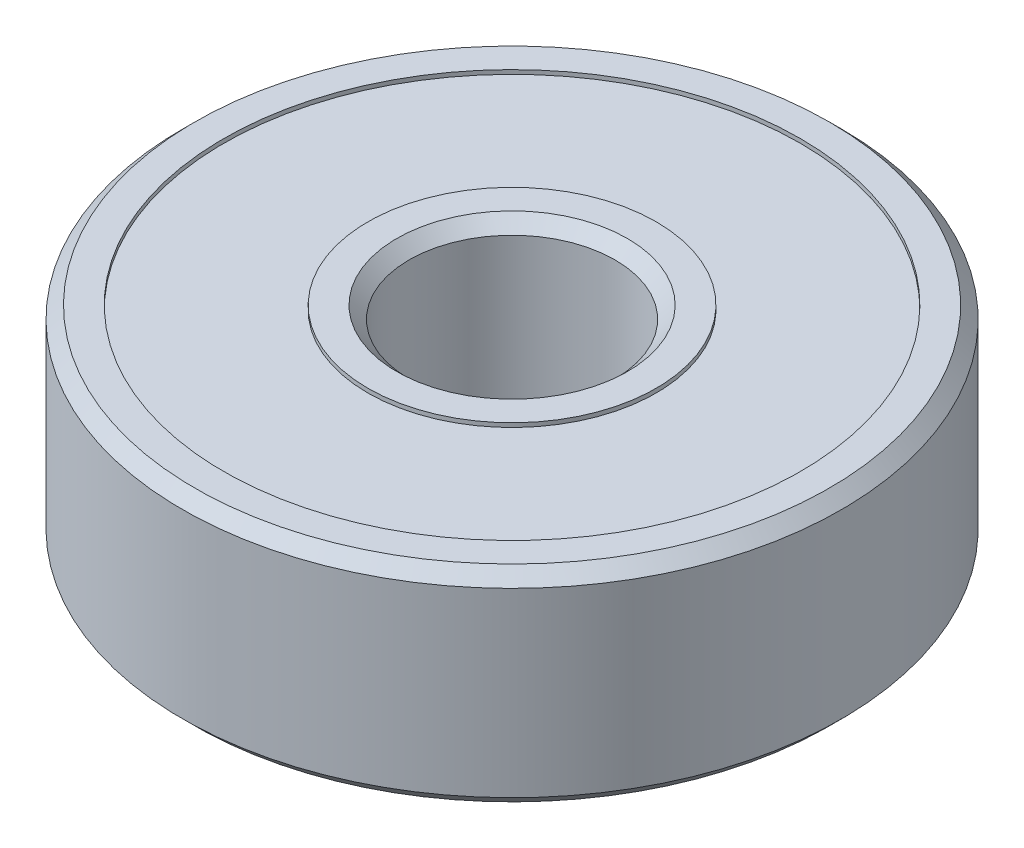
ISO-10303-21;
HEADER;
FILE_DESCRIPTION(('STEP AP214'),'2;1');
FILE_NAME('part.step','',(''),(''),'','','');
FILE_SCHEMA(('AUTOMOTIVE_DESIGN { 1 0 10303 214 1 1 1 1 }'));
ENDSEC;
DATA;
#1=APPLICATION_CONTEXT('core data for automotive mechanical design processes');
#2=APPLICATION_PROTOCOL_DEFINITION('international standard','automotive_design',2000,#1);
#3=PRODUCT_CONTEXT('',#1,'mechanical');
#4=PRODUCT('Part','Part','',(#3));
#5=PRODUCT_RELATED_PRODUCT_CATEGORY('part','',(#4));
#6=PRODUCT_DEFINITION_FORMATION('','',#4);
#7=PRODUCT_DEFINITION_CONTEXT('part definition',#1,'design');
#8=PRODUCT_DEFINITION('design','',#6,#7);
#9=PRODUCT_DEFINITION_SHAPE('','',#8);
#10=(LENGTH_UNIT() NAMED_UNIT(*) SI_UNIT(.MILLI.,.METRE.));
#11=(NAMED_UNIT(*) PLANE_ANGLE_UNIT() SI_UNIT($,.RADIAN.));
#12=(NAMED_UNIT(*) SI_UNIT($,.STERADIAN.) SOLID_ANGLE_UNIT());
#13=UNCERTAINTY_MEASURE_WITH_UNIT(LENGTH_MEASURE(1.E-05),#10,'distance_accuracy_value','');
#14=(GEOMETRIC_REPRESENTATION_CONTEXT(3) GLOBAL_UNCERTAINTY_ASSIGNED_CONTEXT((#13)) GLOBAL_UNIT_ASSIGNED_CONTEXT((#10,
#11,#12)) REPRESENTATION_CONTEXT('',''));
#15=CARTESIAN_POINT('',(0.,0.,0.));
#16=DIRECTION('',(0.,0.,1.));
#17=DIRECTION('',(1.,0.,0.));
#18=AXIS2_PLACEMENT_3D('',#15,#16,#17);
#19=CARTESIAN_POINT('',(0.,2.5,0.));
#20=DIRECTION('',(0.,1.,0.));
#21=DIRECTION('',(0.,0.,1.));
#22=AXIS2_PLACEMENT_3D('',#19,#20,#21);
#23=CONICAL_SURFACE('',#22,2.8,0.785398163397448);
#24=CARTESIAN_POINT('',(0.,2.2,0.));
#25=DIRECTION('',(0.,-1.,0.));
#26=DIRECTION('',(0.,0.,-1.));
#27=AXIS2_PLACEMENT_3D('',#24,#25,#26);
#28=CIRCLE('',#27,2.5);
#29=CARTESIAN_POINT('',(0.,2.2,-2.5));
#30=VERTEX_POINT('',#29);
#31=EDGE_CURVE('E84',#30,#30,#28,.T.);
#32=ORIENTED_EDGE('',*,*,#31,.T.);
#33=EDGE_LOOP('',(#32));
#34=FACE_BOUND('',#33,.T.);
#35=CARTESIAN_POINT('',(0.,2.5,0.));
#36=DIRECTION('',(0.,-1.,0.));
#37=DIRECTION('',(0.,0.,-1.));
#38=AXIS2_PLACEMENT_3D('',#35,#36,#37);
#39=CIRCLE('',#38,2.8);
#40=CARTESIAN_POINT('',(0.,2.5,-2.8));
#41=VERTEX_POINT('',#40);
#42=EDGE_CURVE('E10',#41,#41,#39,.T.);
#43=ORIENTED_EDGE('',*,*,#42,.F.);
#44=EDGE_LOOP('',(#43));
#45=FACE_BOUND('',#44,.T.);
#46=ADVANCED_FACE('F32',(#34,#45),#23,.F.);
#47=CARTESIAN_POINT('',(2.8,2.5,0.));
#48=DIRECTION('',(0.,1.,0.));
#49=DIRECTION('',(0.,0.,1.));
#50=AXIS2_PLACEMENT_3D('',#47,#48,#49);
#51=PLANE('',#50);
#52=ORIENTED_EDGE('',*,*,#42,.T.);
#53=EDGE_LOOP('',(#52));
#54=FACE_BOUND('',#53,.T.);
#55=CARTESIAN_POINT('',(0.,2.5,0.));
#56=DIRECTION('',(0.,-1.,0.));
#57=DIRECTION('',(0.,0.,-1.));
#58=AXIS2_PLACEMENT_3D('',#55,#56,#57);
#59=CIRCLE('',#58,3.5);
#60=CARTESIAN_POINT('',(0.,2.5,-3.5));
#61=VERTEX_POINT('',#60);
#62=EDGE_CURVE('E38',#61,#61,#59,.T.);
#63=ORIENTED_EDGE('',*,*,#62,.F.);
#64=EDGE_LOOP('',(#63));
#65=FACE_BOUND('',#64,.T.);
#66=ADVANCED_FACE('F102',(#54,#65),#51,.T.);
#67=CARTESIAN_POINT('',(0.,0.,0.));
#68=DIRECTION('',(0.,-1.,0.));
#69=DIRECTION('',(0.,0.,-1.));
#70=AXIS2_PLACEMENT_3D('',#67,#68,#69);
#71=CYLINDRICAL_SURFACE('',#70,3.5);
#72=ORIENTED_EDGE('',*,*,#62,.T.);
#73=EDGE_LOOP('',(#72));
#74=FACE_BOUND('',#73,.T.);
#75=CARTESIAN_POINT('',(0.,2.4,0.));
#76=DIRECTION('',(0.,-1.,0.));
#77=DIRECTION('',(0.,0.,-1.));
#78=AXIS2_PLACEMENT_3D('',#75,#76,#77);
#79=CIRCLE('',#78,3.5);
#80=CARTESIAN_POINT('',(0.,2.4,-3.5));
#81=VERTEX_POINT('',#80);
#82=EDGE_CURVE('E42',#81,#81,#79,.T.);
#83=ORIENTED_EDGE('',*,*,#82,.F.);
#84=EDGE_LOOP('',(#83));
#85=FACE_BOUND('',#84,.T.);
#86=ADVANCED_FACE('F106',(#74,#85),#71,.T.);
#87=CARTESIAN_POINT('',(3.5,2.4,0.));
#88=DIRECTION('',(0.,1.,0.));
#89=DIRECTION('',(0.,0.,1.));
#90=AXIS2_PLACEMENT_3D('',#87,#88,#89);
#91=PLANE('',#90);
#92=ORIENTED_EDGE('',*,*,#82,.T.);
#93=EDGE_LOOP('',(#92));
#94=FACE_BOUND('',#93,.T.);
#95=CARTESIAN_POINT('',(0.,2.4,0.));
#96=DIRECTION('',(0.,-1.,0.));
#97=DIRECTION('',(0.,0.,-1.));
#98=AXIS2_PLACEMENT_3D('',#95,#96,#97);
#99=CIRCLE('',#98,7.);
#100=CARTESIAN_POINT('',(0.,2.4,-7.));
#101=VERTEX_POINT('',#100);
#102=EDGE_CURVE('E46',#101,#101,#99,.T.);
#103=ORIENTED_EDGE('',*,*,#102,.F.);
#104=EDGE_LOOP('',(#103));
#105=FACE_BOUND('',#104,.T.);
#106=ADVANCED_FACE('F110',(#94,#105),#91,.T.);
#107=CARTESIAN_POINT('',(0.,0.,0.));
#108=DIRECTION('',(0.,-1.,0.));
#109=DIRECTION('',(0.,0.,-1.));
#110=AXIS2_PLACEMENT_3D('',#107,#108,#109);
#111=CYLINDRICAL_SURFACE('',#110,7.);
#112=ORIENTED_EDGE('',*,*,#102,.T.);
#113=EDGE_LOOP('',(#112));
#114=FACE_BOUND('',#113,.T.);
#115=CARTESIAN_POINT('',(0.,2.5,0.));
#116=DIRECTION('',(0.,-1.,0.));
#117=DIRECTION('',(0.,0.,-1.));
#118=AXIS2_PLACEMENT_3D('',#115,#116,#117);
#119=CIRCLE('',#118,7.);
#120=CARTESIAN_POINT('',(0.,2.5,-7.));
#121=VERTEX_POINT('',#120);
#122=EDGE_CURVE('E51',#121,#121,#119,.T.);
#123=ORIENTED_EDGE('',*,*,#122,.F.);
#124=EDGE_LOOP('',(#123));
#125=FACE_BOUND('',#124,.T.);
#126=ADVANCED_FACE('F116',(#114,#125),#111,.F.);
#127=CARTESIAN_POINT('',(7.,2.5,0.));
#128=DIRECTION('',(0.,1.,0.));
#129=DIRECTION('',(0.,0.,1.));
#130=AXIS2_PLACEMENT_3D('',#127,#128,#129);
#131=PLANE('',#130);
#132=ORIENTED_EDGE('',*,*,#122,.T.);
#133=EDGE_LOOP('',(#132));
#134=FACE_BOUND('',#133,.T.);
#135=CARTESIAN_POINT('',(0.,2.5,0.));
#136=DIRECTION('',(0.,-1.,0.));
#137=DIRECTION('',(0.,0.,-1.));
#138=AXIS2_PLACEMENT_3D('',#135,#136,#137);
#139=CIRCLE('',#138,7.7);
#140=CARTESIAN_POINT('',(0.,2.5,-7.7));
#141=VERTEX_POINT('',#140);
#142=EDGE_CURVE('E54',#141,#141,#139,.T.);
#143=ORIENTED_EDGE('',*,*,#142,.F.);
#144=EDGE_LOOP('',(#143));
#145=FACE_BOUND('',#144,.T.);
#146=ADVANCED_FACE('F120',(#134,#145),#131,.T.);
#147=CARTESIAN_POINT('',(0.,2.2,0.));
#148=DIRECTION('',(0.,-1.,0.));
#149=DIRECTION('',(0.,0.,-1.));
#150=AXIS2_PLACEMENT_3D('',#147,#148,#149);
#151=CONICAL_SURFACE('',#150,8.,0.785398163397448);
#152=ORIENTED_EDGE('',*,*,#142,.T.);
#153=EDGE_LOOP('',(#152));
#154=FACE_BOUND('',#153,.T.);
#155=CARTESIAN_POINT('',(0.,2.2,0.));
#156=DIRECTION('',(0.,-1.,0.));
#157=DIRECTION('',(0.,0.,-1.));
#158=AXIS2_PLACEMENT_3D('',#155,#156,#157);
#159=CIRCLE('',#158,8.);
#160=CARTESIAN_POINT('',(0.,2.2,-8.));
#161=VERTEX_POINT('',#160);
#162=EDGE_CURVE('E57',#161,#161,#159,.T.);
#163=ORIENTED_EDGE('',*,*,#162,.F.);
#164=EDGE_LOOP('',(#163));
#165=FACE_BOUND('',#164,.T.);
#166=ADVANCED_FACE('F124',(#154,#165),#151,.T.);
#167=CARTESIAN_POINT('',(0.,0.,0.));
#168=DIRECTION('',(0.,-1.,0.));
#169=DIRECTION('',(0.,0.,-1.));
#170=AXIS2_PLACEMENT_3D('',#167,#168,#169);
#171=CYLINDRICAL_SURFACE('',#170,8.);
#172=ORIENTED_EDGE('',*,*,#162,.T.);
#173=EDGE_LOOP('',(#172));
#174=FACE_BOUND('',#173,.T.);
#175=CARTESIAN_POINT('',(0.,-2.2,0.));
#176=DIRECTION('',(0.,-1.,0.));
#177=DIRECTION('',(0.,0.,-1.));
#178=AXIS2_PLACEMENT_3D('',#175,#176,#177);
#179=CIRCLE('',#178,8.);
#180=CARTESIAN_POINT('',(0.,-2.2,-8.));
#181=VERTEX_POINT('',#180);
#182=EDGE_CURVE('E60',#181,#181,#179,.T.);
#183=ORIENTED_EDGE('',*,*,#182,.F.);
#184=EDGE_LOOP('',(#183));
#185=FACE_BOUND('',#184,.T.);
#186=ADVANCED_FACE('F128',(#174,#185),#171,.T.);
#187=CARTESIAN_POINT('',(0.,-2.5,0.));
#188=DIRECTION('',(0.,1.,0.));
#189=DIRECTION('',(0.,0.,1.));
#190=AXIS2_PLACEMENT_3D('',#187,#188,#189);
#191=CONICAL_SURFACE('',#190,7.7,0.785398163397448);
#192=ORIENTED_EDGE('',*,*,#182,.T.);
#193=EDGE_LOOP('',(#192));
#194=FACE_BOUND('',#193,.T.);
#195=CARTESIAN_POINT('',(0.,-2.5,0.));
#196=DIRECTION('',(0.,-1.,0.));
#197=DIRECTION('',(0.,0.,-1.));
#198=AXIS2_PLACEMENT_3D('',#195,#196,#197);
#199=CIRCLE('',#198,7.7);
#200=CARTESIAN_POINT('',(0.,-2.5,-7.7));
#201=VERTEX_POINT('',#200);
#202=EDGE_CURVE('E63',#201,#201,#199,.T.);
#203=ORIENTED_EDGE('',*,*,#202,.F.);
#204=EDGE_LOOP('',(#203));
#205=FACE_BOUND('',#204,.T.);
#206=ADVANCED_FACE('F132',(#194,#205),#191,.T.);
#207=CARTESIAN_POINT('',(7.,-2.5,0.));
#208=DIRECTION('',(0.,-1.,0.));
#209=DIRECTION('',(0.,0.,-1.));
#210=AXIS2_PLACEMENT_3D('',#207,#208,#209);
#211=PLANE('',#210);
#212=ORIENTED_EDGE('',*,*,#202,.T.);
#213=EDGE_LOOP('',(#212));
#214=FACE_BOUND('',#213,.T.);
#215=CARTESIAN_POINT('',(0.,-2.5,0.));
#216=DIRECTION('',(0.,-1.,0.));
#217=DIRECTION('',(0.,0.,-1.));
#218=AXIS2_PLACEMENT_3D('',#215,#216,#217);
#219=CIRCLE('',#218,7.);
#220=CARTESIAN_POINT('',(0.,-2.5,-7.));
#221=VERTEX_POINT('',#220);
#222=EDGE_CURVE('E66',#221,#221,#219,.T.);
#223=ORIENTED_EDGE('',*,*,#222,.F.);
#224=EDGE_LOOP('',(#223));
#225=FACE_BOUND('',#224,.T.);
#226=ADVANCED_FACE('F136',(#214,#225),#211,.T.);
#227=CARTESIAN_POINT('',(0.,0.,0.));
#228=DIRECTION('',(0.,-1.,0.));
#229=DIRECTION('',(0.,0.,-1.));
#230=AXIS2_PLACEMENT_3D('',#227,#228,#229);
#231=CYLINDRICAL_SURFACE('',#230,7.);
#232=ORIENTED_EDGE('',*,*,#222,.T.);
#233=EDGE_LOOP('',(#232));
#234=FACE_BOUND('',#233,.T.);
#235=CARTESIAN_POINT('',(0.,-2.4,0.));
#236=DIRECTION('',(0.,-1.,0.));
#237=DIRECTION('',(0.,0.,-1.));
#238=AXIS2_PLACEMENT_3D('',#235,#236,#237);
#239=CIRCLE('',#238,7.);
#240=CARTESIAN_POINT('',(0.,-2.4,-7.));
#241=VERTEX_POINT('',#240);
#242=EDGE_CURVE('E69',#241,#241,#239,.T.);
#243=ORIENTED_EDGE('',*,*,#242,.F.);
#244=EDGE_LOOP('',(#243));
#245=FACE_BOUND('',#244,.T.);
#246=ADVANCED_FACE('F140',(#234,#245),#231,.F.);
#247=CARTESIAN_POINT('',(3.5,-2.4,0.));
#248=DIRECTION('',(0.,-1.,0.));
#249=DIRECTION('',(0.,0.,-1.));
#250=AXIS2_PLACEMENT_3D('',#247,#248,#249);
#251=PLANE('',#250);
#252=ORIENTED_EDGE('',*,*,#242,.T.);
#253=EDGE_LOOP('',(#252));
#254=FACE_BOUND('',#253,.T.);
#255=CARTESIAN_POINT('',(0.,-2.4,0.));
#256=DIRECTION('',(0.,-1.,0.));
#257=DIRECTION('',(0.,0.,-1.));
#258=AXIS2_PLACEMENT_3D('',#255,#256,#257);
#259=CIRCLE('',#258,3.5);
#260=CARTESIAN_POINT('',(0.,-2.4,-3.5));
#261=VERTEX_POINT('',#260);
#262=EDGE_CURVE('E72',#261,#261,#259,.T.);
#263=ORIENTED_EDGE('',*,*,#262,.F.);
#264=EDGE_LOOP('',(#263));
#265=FACE_BOUND('',#264,.T.);
#266=ADVANCED_FACE('F144',(#254,#265),#251,.T.);
#267=CARTESIAN_POINT('',(0.,0.,0.));
#268=DIRECTION('',(0.,-1.,0.));
#269=DIRECTION('',(0.,0.,-1.));
#270=AXIS2_PLACEMENT_3D('',#267,#268,#269);
#271=CYLINDRICAL_SURFACE('',#270,3.5);
#272=ORIENTED_EDGE('',*,*,#262,.T.);
#273=EDGE_LOOP('',(#272));
#274=FACE_BOUND('',#273,.T.);
#275=CARTESIAN_POINT('',(0.,-2.5,0.));
#276=DIRECTION('',(0.,-1.,0.));
#277=DIRECTION('',(0.,0.,-1.));
#278=AXIS2_PLACEMENT_3D('',#275,#276,#277);
#279=CIRCLE('',#278,3.5);
#280=CARTESIAN_POINT('',(0.,-2.5,-3.5));
#281=VERTEX_POINT('',#280);
#282=EDGE_CURVE('E75',#281,#281,#279,.T.);
#283=ORIENTED_EDGE('',*,*,#282,.F.);
#284=EDGE_LOOP('',(#283));
#285=FACE_BOUND('',#284,.T.);
#286=ADVANCED_FACE('F148',(#274,#285),#271,.T.);
#287=CARTESIAN_POINT('',(2.8,-2.5,0.));
#288=DIRECTION('',(0.,-1.,0.));
#289=DIRECTION('',(0.,0.,-1.));
#290=AXIS2_PLACEMENT_3D('',#287,#288,#289);
#291=PLANE('',#290);
#292=ORIENTED_EDGE('',*,*,#282,.T.);
#293=EDGE_LOOP('',(#292));
#294=FACE_BOUND('',#293,.T.);
#295=CARTESIAN_POINT('',(0.,-2.5,0.));
#296=DIRECTION('',(0.,-1.,0.));
#297=DIRECTION('',(0.,0.,-1.));
#298=AXIS2_PLACEMENT_3D('',#295,#296,#297);
#299=CIRCLE('',#298,2.8);
#300=CARTESIAN_POINT('',(0.,-2.5,-2.8));
#301=VERTEX_POINT('',#300);
#302=EDGE_CURVE('E78',#301,#301,#299,.T.);
#303=ORIENTED_EDGE('',*,*,#302,.F.);
#304=EDGE_LOOP('',(#303));
#305=FACE_BOUND('',#304,.T.);
#306=ADVANCED_FACE('F98',(#294,#305),#291,.T.);
#307=CARTESIAN_POINT('',(0.,-2.2,0.));
#308=DIRECTION('',(0.,-1.,0.));
#309=DIRECTION('',(0.,0.,-1.));
#310=AXIS2_PLACEMENT_3D('',#307,#308,#309);
#311=CONICAL_SURFACE('',#310,2.5,0.785398163397448);
#312=ORIENTED_EDGE('',*,*,#302,.T.);
#313=EDGE_LOOP('',(#312));
#314=FACE_BOUND('',#313,.T.);
#315=CARTESIAN_POINT('',(0.,-2.2,0.));
#316=DIRECTION('',(0.,-1.,0.));
#317=DIRECTION('',(0.,0.,-1.));
#318=AXIS2_PLACEMENT_3D('',#315,#316,#317);
#319=CIRCLE('',#318,2.5);
#320=CARTESIAN_POINT('',(0.,-2.2,-2.5));
#321=VERTEX_POINT('',#320);
#322=EDGE_CURVE('E81',#321,#321,#319,.T.);
#323=ORIENTED_EDGE('',*,*,#322,.F.);
#324=EDGE_LOOP('',(#323));
#325=FACE_BOUND('',#324,.T.);
#326=ADVANCED_FACE('F92',(#314,#325),#311,.F.);
#327=CARTESIAN_POINT('',(0.,0.,0.));
#328=DIRECTION('',(0.,-1.,0.));
#329=DIRECTION('',(0.,0.,-1.));
#330=AXIS2_PLACEMENT_3D('',#327,#328,#329);
#331=CYLINDRICAL_SURFACE('',#330,2.5);
#332=ORIENTED_EDGE('',*,*,#322,.T.);
#333=EDGE_LOOP('',(#332));
#334=FACE_BOUND('',#333,.T.);
#335=ORIENTED_EDGE('',*,*,#31,.F.);
#336=EDGE_LOOP('',(#335));
#337=FACE_BOUND('',#336,.T.);
#338=ADVANCED_FACE('F90',(#334,#337),#331,.F.);
#339=CLOSED_SHELL('',(#46,#66,#86,#106,#126,#146,#166,#186,#206,#226,#246,#266,#286,#306,#326,#338));
#340=MANIFOLD_SOLID_BREP('B2',#339);
#341=ADVANCED_BREP_SHAPE_REPRESENTATION('',(#18,#340),#14);
#342=SHAPE_DEFINITION_REPRESENTATION(#9,#341);
ENDSEC;
END-ISO-10303-21;
